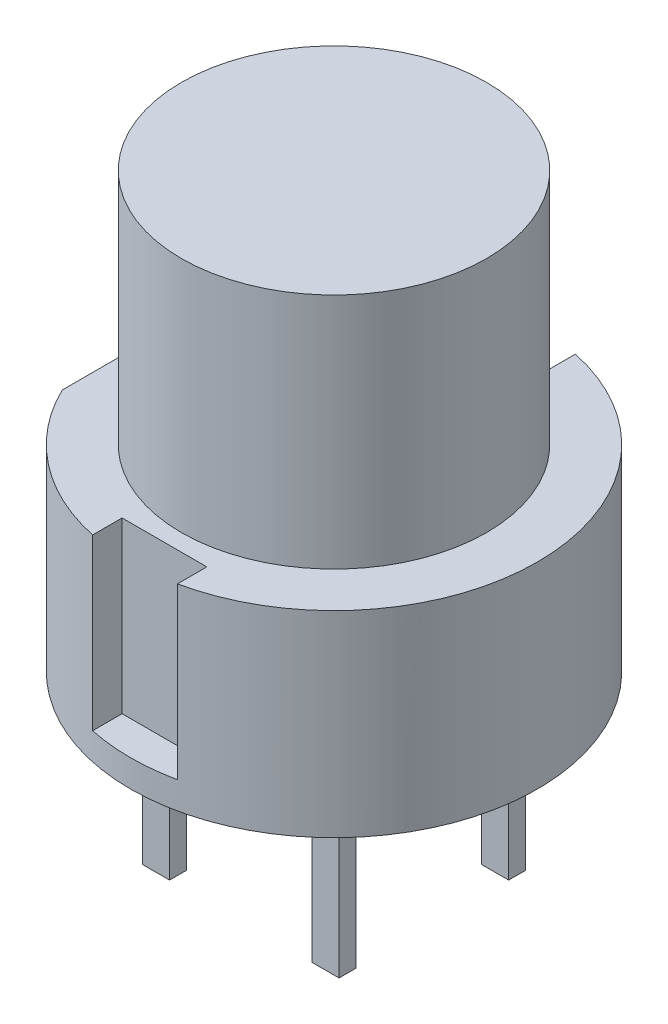
ISO-10303-21;
HEADER;
FILE_DESCRIPTION(('STEP AP214'),'2;1');
FILE_NAME('part.step','',(''),(''),'','','');
FILE_SCHEMA(('AUTOMOTIVE_DESIGN { 1 0 10303 214 1 1 1 1 }'));
ENDSEC;
DATA;
#1=APPLICATION_CONTEXT('core data for automotive mechanical design processes');
#2=APPLICATION_PROTOCOL_DEFINITION('international standard','automotive_design',2000,#1);
#3=PRODUCT_CONTEXT('',#1,'mechanical');
#4=PRODUCT('Part','Part','',(#3));
#5=PRODUCT_RELATED_PRODUCT_CATEGORY('part','',(#4));
#6=PRODUCT_DEFINITION_FORMATION('','',#4);
#7=PRODUCT_DEFINITION_CONTEXT('part definition',#1,'design');
#8=PRODUCT_DEFINITION('design','',#6,#7);
#9=PRODUCT_DEFINITION_SHAPE('','',#8);
#10=(LENGTH_UNIT() NAMED_UNIT(*) SI_UNIT(.MILLI.,.METRE.));
#11=(NAMED_UNIT(*) PLANE_ANGLE_UNIT() SI_UNIT($,.RADIAN.));
#12=(NAMED_UNIT(*) SI_UNIT($,.STERADIAN.) SOLID_ANGLE_UNIT());
#13=UNCERTAINTY_MEASURE_WITH_UNIT(LENGTH_MEASURE(1.E-05),#10,'distance_accuracy_value','');
#14=(GEOMETRIC_REPRESENTATION_CONTEXT(3) GLOBAL_UNCERTAINTY_ASSIGNED_CONTEXT((#13)) GLOBAL_UNIT_ASSIGNED_CONTEXT((#10,
#11,#12)) REPRESENTATION_CONTEXT('',''));
#15=CARTESIAN_POINT('',(0.,0.,0.));
#16=DIRECTION('',(0.,0.,1.));
#17=DIRECTION('',(1.,0.,0.));
#18=AXIS2_PLACEMENT_3D('',#15,#16,#17);
#19=CARTESIAN_POINT('',(2.,1.5,0.));
#20=DIRECTION('',(0.,1.,0.));
#21=DIRECTION('',(0.,0.,1.));
#22=AXIS2_PLACEMENT_3D('',#19,#20,#21);
#23=PLANE('',#22);
#24=DIRECTION('',(-1.,0.,0.));
#25=VECTOR('',#24,1.);
#26=CARTESIAN_POINT('',(2.9,1.5,-2.25000000000001));
#27=LINE('',#26,#25);
#28=CARTESIAN_POINT('',(2.9,1.5,-2.25000000000001));
#29=VERTEX_POINT('',#28);
#30=CARTESIAN_POINT('',(2.1,1.5,-2.25000000000001));
#31=VERTEX_POINT('',#30);
#32=EDGE_CURVE('E299',#29,#31,#27,.T.);
#33=ORIENTED_EDGE('',*,*,#32,.F.);
#34=DIRECTION('',(0.,0.,1.));
#35=VECTOR('',#34,1.);
#36=CARTESIAN_POINT('',(2.9,1.5,-2.25000000000001));
#37=LINE('',#36,#35);
#38=CARTESIAN_POINT('',(2.9,1.5,-2.75000000000001));
#39=VERTEX_POINT('',#38);
#40=EDGE_CURVE('E304',#39,#29,#37,.T.);
#41=ORIENTED_EDGE('',*,*,#40,.F.);
#42=DIRECTION('',(1.,0.,0.));
#43=VECTOR('',#42,1.);
#44=CARTESIAN_POINT('',(2.9,1.5,-2.75000000000001));
#45=LINE('',#44,#43);
#46=CARTESIAN_POINT('',(2.1,1.5,-2.75000000000001));
#47=VERTEX_POINT('',#46);
#48=EDGE_CURVE('E316',#47,#39,#45,.T.);
#49=ORIENTED_EDGE('',*,*,#48,.F.);
#50=DIRECTION('',(0.,0.,-1.));
#51=VECTOR('',#50,1.);
#52=CARTESIAN_POINT('',(2.1,1.5,-2.25000000000001));
#53=LINE('',#52,#51);
#54=EDGE_CURVE('E313',#31,#47,#53,.T.);
#55=ORIENTED_EDGE('',*,*,#54,.F.);
#56=EDGE_LOOP('',(#33,#41,#49,#55));
#57=FACE_BOUND('',#56,.T.);
#58=DIRECTION('',(0.,0.,1.));
#59=VECTOR('',#58,1.);
#60=CARTESIAN_POINT('',(-2.1,1.5,2.25000000000001));
#61=LINE('',#60,#59);
#62=CARTESIAN_POINT('',(-2.1,1.5,2.25000000000001));
#63=VERTEX_POINT('',#62);
#64=CARTESIAN_POINT('',(-2.1,1.5,2.75000000000001));
#65=VERTEX_POINT('',#64);
#66=EDGE_CURVE('E365',#63,#65,#61,.T.);
#67=ORIENTED_EDGE('',*,*,#66,.F.);
#68=DIRECTION('',(1.,0.,0.));
#69=VECTOR('',#68,1.);
#70=CARTESIAN_POINT('',(-2.9,1.5,2.25000000000001));
#71=LINE('',#70,#69);
#72=CARTESIAN_POINT('',(-2.9,1.5,2.25000000000001));
#73=VERTEX_POINT('',#72);
#74=EDGE_CURVE('E370',#73,#63,#71,.T.);
#75=ORIENTED_EDGE('',*,*,#74,.F.);
#76=DIRECTION('',(0.,0.,-1.));
#77=VECTOR('',#76,1.);
#78=CARTESIAN_POINT('',(-2.9,1.5,2.25000000000001));
#79=LINE('',#78,#77);
#80=CARTESIAN_POINT('',(-2.9,1.5,2.75000000000001));
#81=VERTEX_POINT('',#80);
#82=EDGE_CURVE('E382',#81,#73,#79,.T.);
#83=ORIENTED_EDGE('',*,*,#82,.F.);
#84=DIRECTION('',(-1.,0.,0.));
#85=VECTOR('',#84,1.);
#86=CARTESIAN_POINT('',(-2.9,1.5,2.75000000000001));
#87=LINE('',#86,#85);
#88=EDGE_CURVE('E379',#65,#81,#87,.T.);
#89=ORIENTED_EDGE('',*,*,#88,.F.);
#90=EDGE_LOOP('',(#67,#75,#83,#89));
#91=FACE_BOUND('',#90,.T.);
#92=CARTESIAN_POINT('',(0.,1.5,0.));
#93=DIRECTION('',(0.,1.,0.));
#94=DIRECTION('',(0.,0.,1.));
#95=AXIS2_PLACEMENT_3D('',#92,#93,#94);
#96=CIRCLE('',#95,6.);
#97=CARTESIAN_POINT('',(-5.4,1.5,2.61533936612441));
#98=VERTEX_POINT('',#97);
#99=CARTESIAN_POINT('',(-5.4,1.5,-2.61533936612441));
#100=VERTEX_POINT('',#99);
#101=EDGE_CURVE('E408',#98,#100,#96,.T.);
#102=ORIENTED_EDGE('',*,*,#101,.F.);
#103=DIRECTION('',(0.,0.,-1.));
#104=VECTOR('',#103,1.);
#105=CARTESIAN_POINT('',(-5.4,1.5,0.));
#106=LINE('',#105,#104);
#107=EDGE_CURVE('E263',#98,#100,#106,.T.);
#108=ORIENTED_EDGE('',*,*,#107,.T.);
#109=EDGE_LOOP('',(#102,#108));
#110=FACE_BOUND('',#109,.T.);
#111=CARTESIAN_POINT('',(0.,1.5,0.));
#112=DIRECTION('',(0.,1.,0.));
#113=DIRECTION('',(0.,0.,1.));
#114=AXIS2_PLACEMENT_3D('',#111,#112,#113);
#115=CIRCLE('',#114,2.);
#116=CARTESIAN_POINT('',(0.,1.5,2.));
#117=VERTEX_POINT('',#116);
#118=EDGE_CURVE('E412',#117,#117,#115,.T.);
#119=ORIENTED_EDGE('',*,*,#118,.T.);
#120=EDGE_LOOP('',(#119));
#121=FACE_BOUND('',#120,.T.);
#122=DIRECTION('',(0.,0.,1.));
#123=VECTOR('',#122,1.);
#124=CARTESIAN_POINT('',(2.9,1.5,2.25000000000001));
#125=LINE('',#124,#123);
#126=CARTESIAN_POINT('',(2.9,1.5,2.25000000000001));
#127=VERTEX_POINT('',#126);
#128=CARTESIAN_POINT('',(2.9,1.5,2.75000000000001));
#129=VERTEX_POINT('',#128);
#130=EDGE_CURVE('E332',#127,#129,#125,.T.);
#131=ORIENTED_EDGE('',*,*,#130,.F.);
#132=DIRECTION('',(1.,0.,0.));
#133=VECTOR('',#132,1.);
#134=CARTESIAN_POINT('',(2.9,1.5,2.25000000000001));
#135=LINE('',#134,#133);
#136=CARTESIAN_POINT('',(2.1,1.5,2.25000000000001));
#137=VERTEX_POINT('',#136);
#138=EDGE_CURVE('E337',#137,#127,#135,.T.);
#139=ORIENTED_EDGE('',*,*,#138,.F.);
#140=DIRECTION('',(0.,0.,-1.));
#141=VECTOR('',#140,1.);
#142=CARTESIAN_POINT('',(2.1,1.5,2.25000000000001));
#143=LINE('',#142,#141);
#144=CARTESIAN_POINT('',(2.1,1.5,2.75000000000001));
#145=VERTEX_POINT('',#144);
#146=EDGE_CURVE('E349',#145,#137,#143,.T.);
#147=ORIENTED_EDGE('',*,*,#146,.F.);
#148=DIRECTION('',(-1.,0.,0.));
#149=VECTOR('',#148,1.);
#150=CARTESIAN_POINT('',(2.9,1.5,2.75000000000001));
#151=LINE('',#150,#149);
#152=EDGE_CURVE('E346',#129,#145,#151,.T.);
#153=ORIENTED_EDGE('',*,*,#152,.F.);
#154=EDGE_LOOP('',(#131,#139,#147,#153));
#155=FACE_BOUND('',#154,.T.);
#156=DIRECTION('',(-1.,0.,0.));
#157=VECTOR('',#156,1.);
#158=CARTESIAN_POINT('',(-2.9,1.5,-2.25000000000001));
#159=LINE('',#158,#157);
#160=CARTESIAN_POINT('',(-2.1,1.5,-2.25000000000001));
#161=VERTEX_POINT('',#160);
#162=CARTESIAN_POINT('',(-2.9,1.5,-2.25000000000001));
#163=VERTEX_POINT('',#162);
#164=EDGE_CURVE('E266',#161,#163,#159,.T.);
#165=ORIENTED_EDGE('',*,*,#164,.F.);
#166=DIRECTION('',(0.,0.,1.));
#167=VECTOR('',#166,1.);
#168=CARTESIAN_POINT('',(-2.1,1.5,-2.25000000000001));
#169=LINE('',#168,#167);
#170=CARTESIAN_POINT('',(-2.1,1.5,-2.75000000000001));
#171=VERTEX_POINT('',#170);
#172=EDGE_CURVE('E271',#171,#161,#169,.T.);
#173=ORIENTED_EDGE('',*,*,#172,.F.);
#174=DIRECTION('',(1.,0.,0.));
#175=VECTOR('',#174,1.);
#176=CARTESIAN_POINT('',(-2.9,1.5,-2.75000000000001));
#177=LINE('',#176,#175);
#178=CARTESIAN_POINT('',(-2.9,1.5,-2.75000000000001));
#179=VERTEX_POINT('',#178);
#180=EDGE_CURVE('E283',#179,#171,#177,.T.);
#181=ORIENTED_EDGE('',*,*,#180,.F.);
#182=DIRECTION('',(0.,0.,-1.));
#183=VECTOR('',#182,1.);
#184=CARTESIAN_POINT('',(-2.9,1.5,-2.25000000000001));
#185=LINE('',#184,#183);
#186=EDGE_CURVE('E280',#163,#179,#185,.T.);
#187=ORIENTED_EDGE('',*,*,#186,.F.);
#188=EDGE_LOOP('',(#165,#173,#181,#187));
#189=FACE_BOUND('',#188,.T.);
#190=ADVANCED_FACE('F30',(#57,#91,#110,#121,#155,#189),#23,.F.);
#191=CARTESIAN_POINT('',(0.,0.,0.));
#192=DIRECTION('',(0.,1.,0.));
#193=DIRECTION('',(0.,0.,1.));
#194=AXIS2_PLACEMENT_3D('',#191,#192,#193);
#195=PLANE('',#194);
#196=CARTESIAN_POINT('',(0.,0.,0.));
#197=DIRECTION('',(0.,1.,0.));
#198=DIRECTION('',(0.,0.,1.));
#199=AXIS2_PLACEMENT_3D('',#196,#197,#198);
#200=CIRCLE('',#199,2.);
#201=CARTESIAN_POINT('',(0.,0.,2.));
#202=VERTEX_POINT('',#201);
#203=EDGE_CURVE('E415',#202,#202,#200,.T.);
#204=ORIENTED_EDGE('',*,*,#203,.F.);
#205=EDGE_LOOP('',(#204));
#206=FACE_BOUND('',#205,.T.);
#207=ADVANCED_FACE('F32',(#206),#195,.F.);
#208=CARTESIAN_POINT('',(0.,33.18289666439,0.));
#209=DIRECTION('',(0.,1.,0.));
#210=DIRECTION('',(0.,0.,1.));
#211=AXIS2_PLACEMENT_3D('',#208,#209,#210);
#212=CYLINDRICAL_SURFACE('',#211,2.);
#213=ORIENTED_EDGE('',*,*,#118,.F.);
#214=EDGE_LOOP('',(#213));
#215=FACE_BOUND('',#214,.T.);
#216=ORIENTED_EDGE('',*,*,#203,.T.);
#217=EDGE_LOOP('',(#216));
#218=FACE_BOUND('',#217,.T.);
#219=ADVANCED_FACE('F547',(#215,#218),#212,.T.);
#220=CARTESIAN_POINT('',(0.,33.18289666439,0.));
#221=DIRECTION('',(0.,1.,0.));
#222=DIRECTION('',(0.,0.,1.));
#223=AXIS2_PLACEMENT_3D('',#220,#221,#222);
#224=CYLINDRICAL_SURFACE('',#223,6.);
#225=CARTESIAN_POINT('',(0.,7.3,0.));
#226=DIRECTION('',(0.,1.,0.));
#227=DIRECTION('',(0.,0.,1.));
#228=AXIS2_PLACEMENT_3D('',#225,#226,#227);
#229=CIRCLE('',#228,6.);
#230=CARTESIAN_POINT('',(1.25,7.3,5.86834729715275));
#231=VERTEX_POINT('',#230);
#232=CARTESIAN_POINT('',(1.25,7.3,-5.86834729715275));
#233=VERTEX_POINT('',#232);
#234=EDGE_CURVE('E409',#231,#233,#229,.T.);
#235=ORIENTED_EDGE('',*,*,#234,.F.);
#236=DIRECTION('',(0.,1.,0.));
#237=VECTOR('',#236,1.);
#238=CARTESIAN_POINT('',(1.25,33.18289666439,5.86834729715275));
#239=LINE('',#238,#237);
#240=CARTESIAN_POINT('',(1.25,2.3,5.86834729715275));
#241=VERTEX_POINT('',#240);
#242=EDGE_CURVE('E231',#231,#241,#239,.F.);
#243=ORIENTED_EDGE('',*,*,#242,.T.);
#244=CARTESIAN_POINT('',(0.,2.3,0.));
#245=DIRECTION('',(0.,-1.,0.));
#246=DIRECTION('',(0.,0.,-1.));
#247=AXIS2_PLACEMENT_3D('',#244,#245,#246);
#248=CIRCLE('',#247,6.);
#249=CARTESIAN_POINT('',(-1.25,2.3,5.86834729715275));
#250=VERTEX_POINT('',#249);
#251=EDGE_CURVE('E11',#241,#250,#248,.T.);
#252=ORIENTED_EDGE('',*,*,#251,.T.);
#253=DIRECTION('',(0.,1.,0.));
#254=VECTOR('',#253,1.);
#255=CARTESIAN_POINT('',(-1.25,33.18289666439,5.86834729715275));
#256=LINE('',#255,#254);
#257=CARTESIAN_POINT('',(-1.25,7.3,5.86834729715275));
#258=VERTEX_POINT('',#257);
#259=EDGE_CURVE('E217',#250,#258,#256,.T.);
#260=ORIENTED_EDGE('',*,*,#259,.T.);
#261=CARTESIAN_POINT('',(-5.4,7.3,2.61533936612441));
#262=VERTEX_POINT('',#261);
#263=EDGE_CURVE('E405',#262,#258,#229,.T.);
#264=ORIENTED_EDGE('',*,*,#263,.F.);
#265=DIRECTION('',(0.,1.,0.));
#266=VECTOR('',#265,1.);
#267=CARTESIAN_POINT('',(-5.4,33.18289666439,2.61533936612441));
#268=LINE('',#267,#266);
#269=EDGE_CURVE('E257',#262,#98,#268,.F.);
#270=ORIENTED_EDGE('',*,*,#269,.T.);
#271=ORIENTED_EDGE('',*,*,#101,.T.);
#272=DIRECTION('',(0.,1.,0.));
#273=VECTOR('',#272,1.);
#274=CARTESIAN_POINT('',(-5.4,33.18289666439,-2.61533936612441));
#275=LINE('',#274,#273);
#276=CARTESIAN_POINT('',(-5.4,7.3,-2.61533936612441));
#277=VERTEX_POINT('',#276);
#278=EDGE_CURVE('E260',#100,#277,#275,.T.);
#279=ORIENTED_EDGE('',*,*,#278,.T.);
#280=CARTESIAN_POINT('',(-1.25,7.3,-5.86834729715275));
#281=VERTEX_POINT('',#280);
#282=EDGE_CURVE('E404',#281,#277,#229,.T.);
#283=ORIENTED_EDGE('',*,*,#282,.F.);
#284=DIRECTION('',(0.,1.,0.));
#285=VECTOR('',#284,1.);
#286=CARTESIAN_POINT('',(-1.25,33.18289666439,-5.86834729715275));
#287=LINE('',#286,#285);
#288=CARTESIAN_POINT('',(-1.25,2.3,-5.86834729715275));
#289=VERTEX_POINT('',#288);
#290=EDGE_CURVE('E53',#281,#289,#287,.F.);
#291=ORIENTED_EDGE('',*,*,#290,.T.);
#292=CARTESIAN_POINT('',(0.,2.3,0.));
#293=DIRECTION('',(0.,-1.,0.));
#294=DIRECTION('',(0.,0.,-1.));
#295=AXIS2_PLACEMENT_3D('',#292,#293,#294);
#296=CIRCLE('',#295,6.);
#297=CARTESIAN_POINT('',(1.25,2.3,-5.86834729715275));
#298=VERTEX_POINT('',#297);
#299=EDGE_CURVE('E423',#289,#298,#296,.T.);
#300=ORIENTED_EDGE('',*,*,#299,.T.);
#301=DIRECTION('',(0.,1.,0.));
#302=VECTOR('',#301,1.);
#303=CARTESIAN_POINT('',(1.25,33.18289666439,-5.86834729715275));
#304=LINE('',#303,#302);
#305=EDGE_CURVE('E254',#298,#233,#304,.T.);
#306=ORIENTED_EDGE('',*,*,#305,.T.);
#307=EDGE_LOOP('',(#235,#243,#252,#260,#264,#270,#271,#279,#283,#291,#300,#306));
#308=FACE_BOUND('',#307,.T.);
#309=ADVANCED_FACE('F432',(#308),#224,.T.);
#310=CARTESIAN_POINT('',(6.,7.3,0.));
#311=DIRECTION('',(0.,-1.,0.));
#312=DIRECTION('',(0.,0.,-1.));
#313=AXIS2_PLACEMENT_3D('',#310,#311,#312);
#314=PLANE('',#313);
#315=CARTESIAN_POINT('',(0.,7.3,0.));
#316=DIRECTION('',(0.,1.,0.));
#317=DIRECTION('',(0.,0.,1.));
#318=AXIS2_PLACEMENT_3D('',#315,#316,#317);
#319=CIRCLE('',#318,4.5);
#320=CARTESIAN_POINT('',(0.,7.3,4.5));
#321=VERTEX_POINT('',#320);
#322=EDGE_CURVE('E401',#321,#321,#319,.T.);
#323=ORIENTED_EDGE('',*,*,#322,.F.);
#324=EDGE_LOOP('',(#323));
#325=FACE_BOUND('',#324,.T.);
#326=DIRECTION('',(-1.,0.,0.));
#327=VECTOR('',#326,1.);
#328=CARTESIAN_POINT('',(-1.25,7.3,5.));
#329=LINE('',#328,#327);
#330=CARTESIAN_POINT('',(1.25,7.3,5.));
#331=VERTEX_POINT('',#330);
#332=CARTESIAN_POINT('',(-1.25,7.3,5.));
#333=VERTEX_POINT('',#332);
#334=EDGE_CURVE('E45',#331,#333,#329,.T.);
#335=ORIENTED_EDGE('',*,*,#334,.F.);
#336=DIRECTION('',(0.,0.,1.));
#337=VECTOR('',#336,1.);
#338=CARTESIAN_POINT('',(1.25,7.3,0.));
#339=LINE('',#338,#337);
#340=EDGE_CURVE('E38',#331,#231,#339,.T.);
#341=ORIENTED_EDGE('',*,*,#340,.T.);
#342=ORIENTED_EDGE('',*,*,#234,.T.);
#343=DIRECTION('',(0.,0.,-1.));
#344=VECTOR('',#343,1.);
#345=CARTESIAN_POINT('',(1.25,7.3,-5.));
#346=LINE('',#345,#344);
#347=CARTESIAN_POINT('',(1.25,7.3,-5.));
#348=VERTEX_POINT('',#347);
#349=EDGE_CURVE('E234',#348,#233,#346,.T.);
#350=ORIENTED_EDGE('',*,*,#349,.F.);
#351=DIRECTION('',(1.,0.,0.));
#352=VECTOR('',#351,1.);
#353=CARTESIAN_POINT('',(-1.25,7.3,-5.));
#354=LINE('',#353,#352);
#355=CARTESIAN_POINT('',(-1.25,7.3,-5.));
#356=VERTEX_POINT('',#355);
#357=EDGE_CURVE('E239',#356,#348,#354,.T.);
#358=ORIENTED_EDGE('',*,*,#357,.F.);
#359=DIRECTION('',(0.,0.,-1.));
#360=VECTOR('',#359,1.);
#361=CARTESIAN_POINT('',(-1.25,7.3,0.));
#362=LINE('',#361,#360);
#363=EDGE_CURVE('E421',#356,#281,#362,.T.);
#364=ORIENTED_EDGE('',*,*,#363,.T.);
#365=ORIENTED_EDGE('',*,*,#282,.T.);
#366=DIRECTION('',(0.,0.,1.));
#367=VECTOR('',#366,1.);
#368=CARTESIAN_POINT('',(-5.4,7.3,0.));
#369=LINE('',#368,#367);
#370=EDGE_CURVE('E418',#277,#262,#369,.T.);
#371=ORIENTED_EDGE('',*,*,#370,.T.);
#372=ORIENTED_EDGE('',*,*,#263,.T.);
#373=DIRECTION('',(0.,0.,1.));
#374=VECTOR('',#373,1.);
#375=CARTESIAN_POINT('',(-1.25,7.3,5.));
#376=LINE('',#375,#374);
#377=EDGE_CURVE('E223',#333,#258,#376,.T.);
#378=ORIENTED_EDGE('',*,*,#377,.F.);
#379=EDGE_LOOP('',(#335,#341,#342,#350,#358,#364,#365,#371,#372,#378));
#380=FACE_BOUND('',#379,.T.);
#381=ADVANCED_FACE('F428',(#325,#380),#314,.F.);
#382=CARTESIAN_POINT('',(0.,33.18289666439,0.));
#383=DIRECTION('',(0.,1.,0.));
#384=DIRECTION('',(0.,0.,1.));
#385=AXIS2_PLACEMENT_3D('',#382,#383,#384);
#386=CYLINDRICAL_SURFACE('',#385,4.5);
#387=CARTESIAN_POINT('',(0.,14.3,0.));
#388=DIRECTION('',(0.,1.,0.));
#389=DIRECTION('',(0.,0.,1.));
#390=AXIS2_PLACEMENT_3D('',#387,#388,#389);
#391=CIRCLE('',#390,4.5);
#392=CARTESIAN_POINT('',(0.,14.3,4.5));
#393=VERTEX_POINT('',#392);
#394=EDGE_CURVE('E398',#393,#393,#391,.T.);
#395=ORIENTED_EDGE('',*,*,#394,.F.);
#396=EDGE_LOOP('',(#395));
#397=FACE_BOUND('',#396,.T.);
#398=ORIENTED_EDGE('',*,*,#322,.T.);
#399=EDGE_LOOP('',(#398));
#400=FACE_BOUND('',#399,.T.);
#401=ADVANCED_FACE('F538',(#397,#400),#386,.T.);
#402=CARTESIAN_POINT('',(4.5,14.3,0.));
#403=DIRECTION('',(0.,-1.,0.));
#404=DIRECTION('',(0.,0.,-1.));
#405=AXIS2_PLACEMENT_3D('',#402,#403,#404);
#406=PLANE('',#405);
#407=ORIENTED_EDGE('',*,*,#394,.T.);
#408=EDGE_LOOP('',(#407));
#409=FACE_BOUND('',#408,.T.);
#410=ADVANCED_FACE('F534',(#409),#406,.F.);
#411=CARTESIAN_POINT('',(-2.1,-3.5,2.25000000000001));
#412=DIRECTION('',(-1.,0.,0.));
#413=DIRECTION('',(0.,0.,1.));
#414=AXIS2_PLACEMENT_3D('',#411,#412,#413);
#415=PLANE('',#414);
#416=ORIENTED_EDGE('',*,*,#66,.T.);
#417=DIRECTION('',(0.,1.,0.));
#418=VECTOR('',#417,1.);
#419=CARTESIAN_POINT('',(-2.1,-3.5,2.75000000000001));
#420=LINE('',#419,#418);
#421=CARTESIAN_POINT('',(-2.1,-3.5,2.75000000000001));
#422=VERTEX_POINT('',#421);
#423=EDGE_CURVE('E395',#422,#65,#420,.T.);
#424=ORIENTED_EDGE('',*,*,#423,.F.);
#425=DIRECTION('',(0.,0.,1.));
#426=VECTOR('',#425,1.);
#427=CARTESIAN_POINT('',(-2.1,-3.5,2.25000000000001));
#428=LINE('',#427,#426);
#429=CARTESIAN_POINT('',(-2.1,-3.5,2.25000000000001));
#430=VERTEX_POINT('',#429);
#431=EDGE_CURVE('E366',#430,#422,#428,.T.);
#432=ORIENTED_EDGE('',*,*,#431,.F.);
#433=DIRECTION('',(0.,1.,0.));
#434=VECTOR('',#433,1.);
#435=CARTESIAN_POINT('',(-2.1,-3.5,2.25000000000001));
#436=LINE('',#435,#434);
#437=EDGE_CURVE('E376',#430,#63,#436,.T.);
#438=ORIENTED_EDGE('',*,*,#437,.T.);
#439=EDGE_LOOP('',(#416,#424,#432,#438));
#440=FACE_BOUND('',#439,.T.);
#441=ADVANCED_FACE('F530',(#440),#415,.F.);
#442=CARTESIAN_POINT('',(-2.9,-3.5,2.75000000000001));
#443=DIRECTION('',(0.,0.,-1.));
#444=DIRECTION('',(-1.,0.,0.));
#445=AXIS2_PLACEMENT_3D('',#442,#443,#444);
#446=PLANE('',#445);
#447=ORIENTED_EDGE('',*,*,#88,.T.);
#448=DIRECTION('',(0.,1.,0.));
#449=VECTOR('',#448,1.);
#450=CARTESIAN_POINT('',(-2.9,-3.5,2.75000000000001));
#451=LINE('',#450,#449);
#452=CARTESIAN_POINT('',(-2.9,-3.5,2.75000000000001));
#453=VERTEX_POINT('',#452);
#454=EDGE_CURVE('E392',#453,#81,#451,.T.);
#455=ORIENTED_EDGE('',*,*,#454,.F.);
#456=DIRECTION('',(-1.,0.,0.));
#457=VECTOR('',#456,1.);
#458=CARTESIAN_POINT('',(-2.9,-3.5,2.75000000000001));
#459=LINE('',#458,#457);
#460=EDGE_CURVE('E369',#422,#453,#459,.T.);
#461=ORIENTED_EDGE('',*,*,#460,.F.);
#462=ORIENTED_EDGE('',*,*,#423,.T.);
#463=EDGE_LOOP('',(#447,#455,#461,#462));
#464=FACE_BOUND('',#463,.T.);
#465=ADVANCED_FACE('F526',(#464),#446,.F.);
#466=CARTESIAN_POINT('',(-2.9,-3.5,2.25000000000001));
#467=DIRECTION('',(1.,0.,0.));
#468=DIRECTION('',(0.,0.,-1.));
#469=AXIS2_PLACEMENT_3D('',#466,#467,#468);
#470=PLANE('',#469);
#471=ORIENTED_EDGE('',*,*,#82,.T.);
#472=DIRECTION('',(0.,1.,0.));
#473=VECTOR('',#472,1.);
#474=CARTESIAN_POINT('',(-2.9,-3.5,2.25000000000001));
#475=LINE('',#474,#473);
#476=CARTESIAN_POINT('',(-2.9,-3.5,2.25000000000001));
#477=VERTEX_POINT('',#476);
#478=EDGE_CURVE('E389',#477,#73,#475,.T.);
#479=ORIENTED_EDGE('',*,*,#478,.F.);
#480=DIRECTION('',(0.,0.,-1.));
#481=VECTOR('',#480,1.);
#482=CARTESIAN_POINT('',(-2.9,-3.5,2.25000000000001));
#483=LINE('',#482,#481);
#484=EDGE_CURVE('E372',#453,#477,#483,.T.);
#485=ORIENTED_EDGE('',*,*,#484,.F.);
#486=ORIENTED_EDGE('',*,*,#454,.T.);
#487=EDGE_LOOP('',(#471,#479,#485,#486));
#488=FACE_BOUND('',#487,.T.);
#489=ADVANCED_FACE('F522',(#488),#470,.F.);
#490=CARTESIAN_POINT('',(-2.9,-3.5,2.25000000000001));
#491=DIRECTION('',(0.,0.,1.));
#492=DIRECTION('',(1.,0.,0.));
#493=AXIS2_PLACEMENT_3D('',#490,#491,#492);
#494=PLANE('',#493);
#495=ORIENTED_EDGE('',*,*,#74,.T.);
#496=ORIENTED_EDGE('',*,*,#437,.F.);
#497=DIRECTION('',(1.,0.,0.));
#498=VECTOR('',#497,1.);
#499=CARTESIAN_POINT('',(-2.9,-3.5,2.25000000000001));
#500=LINE('',#499,#498);
#501=EDGE_CURVE('E374',#477,#430,#500,.T.);
#502=ORIENTED_EDGE('',*,*,#501,.F.);
#503=ORIENTED_EDGE('',*,*,#478,.T.);
#504=EDGE_LOOP('',(#495,#496,#502,#503));
#505=FACE_BOUND('',#504,.T.);
#506=ADVANCED_FACE('F518',(#505),#494,.F.);
#507=CARTESIAN_POINT('',(-2.1,-3.5,2.75000000000001));
#508=DIRECTION('',(0.,1.,0.));
#509=DIRECTION('',(0.,0.,1.));
#510=AXIS2_PLACEMENT_3D('',#507,#508,#509);
#511=PLANE('',#510);
#512=ORIENTED_EDGE('',*,*,#431,.T.);
#513=ORIENTED_EDGE('',*,*,#460,.T.);
#514=ORIENTED_EDGE('',*,*,#484,.T.);
#515=ORIENTED_EDGE('',*,*,#501,.T.);
#516=EDGE_LOOP('',(#512,#513,#514,#515));
#517=FACE_BOUND('',#516,.T.);
#518=ADVANCED_FACE('F514',(#517),#511,.F.);
#519=CARTESIAN_POINT('',(2.9,-3.5,2.25000000000001));
#520=DIRECTION('',(-1.,0.,0.));
#521=DIRECTION('',(0.,0.,1.));
#522=AXIS2_PLACEMENT_3D('',#519,#520,#521);
#523=PLANE('',#522);
#524=ORIENTED_EDGE('',*,*,#130,.T.);
#525=DIRECTION('',(0.,1.,0.));
#526=VECTOR('',#525,1.);
#527=CARTESIAN_POINT('',(2.9,-3.5,2.75000000000001));
#528=LINE('',#527,#526);
#529=CARTESIAN_POINT('',(2.9,-3.5,2.75000000000001));
#530=VERTEX_POINT('',#529);
#531=EDGE_CURVE('E362',#530,#129,#528,.T.);
#532=ORIENTED_EDGE('',*,*,#531,.F.);
#533=DIRECTION('',(0.,0.,1.));
#534=VECTOR('',#533,1.);
#535=CARTESIAN_POINT('',(2.9,-3.5,2.25000000000001));
#536=LINE('',#535,#534);
#537=CARTESIAN_POINT('',(2.9,-3.5,2.25000000000001));
#538=VERTEX_POINT('',#537);
#539=EDGE_CURVE('E333',#538,#530,#536,.T.);
#540=ORIENTED_EDGE('',*,*,#539,.F.);
#541=DIRECTION('',(0.,1.,0.));
#542=VECTOR('',#541,1.);
#543=CARTESIAN_POINT('',(2.9,-3.5,2.25000000000001));
#544=LINE('',#543,#542);
#545=EDGE_CURVE('E343',#538,#127,#544,.T.);
#546=ORIENTED_EDGE('',*,*,#545,.T.);
#547=EDGE_LOOP('',(#524,#532,#540,#546));
#548=FACE_BOUND('',#547,.T.);
#549=ADVANCED_FACE('F510',(#548),#523,.F.);
#550=CARTESIAN_POINT('',(2.9,-3.5,2.75000000000001));
#551=DIRECTION('',(0.,0.,-1.));
#552=DIRECTION('',(-1.,0.,0.));
#553=AXIS2_PLACEMENT_3D('',#550,#551,#552);
#554=PLANE('',#553);
#555=ORIENTED_EDGE('',*,*,#152,.T.);
#556=DIRECTION('',(0.,1.,0.));
#557=VECTOR('',#556,1.);
#558=CARTESIAN_POINT('',(2.1,-3.5,2.75000000000001));
#559=LINE('',#558,#557);
#560=CARTESIAN_POINT('',(2.1,-3.5,2.75000000000001));
#561=VERTEX_POINT('',#560);
#562=EDGE_CURVE('E359',#561,#145,#559,.T.);
#563=ORIENTED_EDGE('',*,*,#562,.F.);
#564=DIRECTION('',(-1.,0.,0.));
#565=VECTOR('',#564,1.);
#566=CARTESIAN_POINT('',(2.9,-3.5,2.75000000000001));
#567=LINE('',#566,#565);
#568=EDGE_CURVE('E336',#530,#561,#567,.T.);
#569=ORIENTED_EDGE('',*,*,#568,.F.);
#570=ORIENTED_EDGE('',*,*,#531,.T.);
#571=EDGE_LOOP('',(#555,#563,#569,#570));
#572=FACE_BOUND('',#571,.T.);
#573=ADVANCED_FACE('F506',(#572),#554,.F.);
#574=CARTESIAN_POINT('',(2.1,-3.5,2.25000000000001));
#575=DIRECTION('',(1.,0.,0.));
#576=DIRECTION('',(0.,0.,-1.));
#577=AXIS2_PLACEMENT_3D('',#574,#575,#576);
#578=PLANE('',#577);
#579=ORIENTED_EDGE('',*,*,#146,.T.);
#580=DIRECTION('',(0.,1.,0.));
#581=VECTOR('',#580,1.);
#582=CARTESIAN_POINT('',(2.1,-3.5,2.25000000000001));
#583=LINE('',#582,#581);
#584=CARTESIAN_POINT('',(2.1,-3.5,2.25000000000001));
#585=VERTEX_POINT('',#584);
#586=EDGE_CURVE('E356',#585,#137,#583,.T.);
#587=ORIENTED_EDGE('',*,*,#586,.F.);
#588=DIRECTION('',(0.,0.,-1.));
#589=VECTOR('',#588,1.);
#590=CARTESIAN_POINT('',(2.1,-3.5,2.25000000000001));
#591=LINE('',#590,#589);
#592=EDGE_CURVE('E339',#561,#585,#591,.T.);
#593=ORIENTED_EDGE('',*,*,#592,.F.);
#594=ORIENTED_EDGE('',*,*,#562,.T.);
#595=EDGE_LOOP('',(#579,#587,#593,#594));
#596=FACE_BOUND('',#595,.T.);
#597=ADVANCED_FACE('F502',(#596),#578,.F.);
#598=CARTESIAN_POINT('',(2.9,-3.5,2.25000000000001));
#599=DIRECTION('',(0.,0.,1.));
#600=DIRECTION('',(1.,0.,0.));
#601=AXIS2_PLACEMENT_3D('',#598,#599,#600);
#602=PLANE('',#601);
#603=ORIENTED_EDGE('',*,*,#138,.T.);
#604=ORIENTED_EDGE('',*,*,#545,.F.);
#605=DIRECTION('',(1.,0.,0.));
#606=VECTOR('',#605,1.);
#607=CARTESIAN_POINT('',(2.9,-3.5,2.25000000000001));
#608=LINE('',#607,#606);
#609=EDGE_CURVE('E341',#585,#538,#608,.T.);
#610=ORIENTED_EDGE('',*,*,#609,.F.);
#611=ORIENTED_EDGE('',*,*,#586,.T.);
#612=EDGE_LOOP('',(#603,#604,#610,#611));
#613=FACE_BOUND('',#612,.T.);
#614=ADVANCED_FACE('F498',(#613),#602,.F.);
#615=CARTESIAN_POINT('',(2.9,-3.5,2.75000000000001));
#616=DIRECTION('',(0.,-1.,0.));
#617=DIRECTION('',(0.,0.,-1.));
#618=AXIS2_PLACEMENT_3D('',#615,#616,#617);
#619=PLANE('',#618);
#620=ORIENTED_EDGE('',*,*,#539,.T.);
#621=ORIENTED_EDGE('',*,*,#568,.T.);
#622=ORIENTED_EDGE('',*,*,#592,.T.);
#623=ORIENTED_EDGE('',*,*,#609,.T.);
#624=EDGE_LOOP('',(#620,#621,#622,#623));
#625=FACE_BOUND('',#624,.T.);
#626=ADVANCED_FACE('F494',(#625),#619,.T.);
#627=CARTESIAN_POINT('',(2.9,-3.5,-2.25000000000001));
#628=DIRECTION('',(0.,0.,-1.));
#629=DIRECTION('',(-1.,0.,0.));
#630=AXIS2_PLACEMENT_3D('',#627,#628,#629);
#631=PLANE('',#630);
#632=ORIENTED_EDGE('',*,*,#32,.T.);
#633=DIRECTION('',(0.,1.,0.));
#634=VECTOR('',#633,1.);
#635=CARTESIAN_POINT('',(2.1,-3.5,-2.25000000000001));
#636=LINE('',#635,#634);
#637=CARTESIAN_POINT('',(2.1,-3.5,-2.25000000000001));
#638=VERTEX_POINT('',#637);
#639=EDGE_CURVE('E329',#638,#31,#636,.T.);
#640=ORIENTED_EDGE('',*,*,#639,.F.);
#641=DIRECTION('',(-1.,0.,0.));
#642=VECTOR('',#641,1.);
#643=CARTESIAN_POINT('',(2.9,-3.5,-2.25000000000001));
#644=LINE('',#643,#642);
#645=CARTESIAN_POINT('',(2.9,-3.5,-2.25000000000001));
#646=VERTEX_POINT('',#645);
#647=EDGE_CURVE('E300',#646,#638,#644,.T.);
#648=ORIENTED_EDGE('',*,*,#647,.F.);
#649=DIRECTION('',(0.,1.,0.));
#650=VECTOR('',#649,1.);
#651=CARTESIAN_POINT('',(2.9,-3.5,-2.25000000000001));
#652=LINE('',#651,#650);
#653=EDGE_CURVE('E310',#646,#29,#652,.T.);
#654=ORIENTED_EDGE('',*,*,#653,.T.);
#655=EDGE_LOOP('',(#632,#640,#648,#654));
#656=FACE_BOUND('',#655,.T.);
#657=ADVANCED_FACE('F490',(#656),#631,.F.);
#658=CARTESIAN_POINT('',(2.1,-3.5,-2.25000000000001));
#659=DIRECTION('',(1.,0.,0.));
#660=DIRECTION('',(0.,0.,-1.));
#661=AXIS2_PLACEMENT_3D('',#658,#659,#660);
#662=PLANE('',#661);
#663=ORIENTED_EDGE('',*,*,#54,.T.);
#664=DIRECTION('',(0.,1.,0.));
#665=VECTOR('',#664,1.);
#666=CARTESIAN_POINT('',(2.1,-3.5,-2.75000000000001));
#667=LINE('',#666,#665);
#668=CARTESIAN_POINT('',(2.1,-3.5,-2.75000000000001));
#669=VERTEX_POINT('',#668);
#670=EDGE_CURVE('E326',#669,#47,#667,.T.);
#671=ORIENTED_EDGE('',*,*,#670,.F.);
#672=DIRECTION('',(0.,0.,-1.));
#673=VECTOR('',#672,1.);
#674=CARTESIAN_POINT('',(2.1,-3.5,-2.25000000000001));
#675=LINE('',#674,#673);
#676=EDGE_CURVE('E303',#638,#669,#675,.T.);
#677=ORIENTED_EDGE('',*,*,#676,.F.);
#678=ORIENTED_EDGE('',*,*,#639,.T.);
#679=EDGE_LOOP('',(#663,#671,#677,#678));
#680=FACE_BOUND('',#679,.T.);
#681=ADVANCED_FACE('F486',(#680),#662,.F.);
#682=CARTESIAN_POINT('',(2.9,-3.5,-2.75000000000001));
#683=DIRECTION('',(0.,0.,1.));
#684=DIRECTION('',(1.,0.,0.));
#685=AXIS2_PLACEMENT_3D('',#682,#683,#684);
#686=PLANE('',#685);
#687=ORIENTED_EDGE('',*,*,#48,.T.);
#688=DIRECTION('',(0.,1.,0.));
#689=VECTOR('',#688,1.);
#690=CARTESIAN_POINT('',(2.9,-3.5,-2.75000000000001));
#691=LINE('',#690,#689);
#692=CARTESIAN_POINT('',(2.9,-3.5,-2.75000000000001));
#693=VERTEX_POINT('',#692);
#694=EDGE_CURVE('E323',#693,#39,#691,.T.);
#695=ORIENTED_EDGE('',*,*,#694,.F.);
#696=DIRECTION('',(1.,0.,0.));
#697=VECTOR('',#696,1.);
#698=CARTESIAN_POINT('',(2.9,-3.5,-2.75000000000001));
#699=LINE('',#698,#697);
#700=EDGE_CURVE('E306',#669,#693,#699,.T.);
#701=ORIENTED_EDGE('',*,*,#700,.F.);
#702=ORIENTED_EDGE('',*,*,#670,.T.);
#703=EDGE_LOOP('',(#687,#695,#701,#702));
#704=FACE_BOUND('',#703,.T.);
#705=ADVANCED_FACE('F482',(#704),#686,.F.);
#706=CARTESIAN_POINT('',(2.9,-3.5,-2.25000000000001));
#707=DIRECTION('',(-1.,0.,0.));
#708=DIRECTION('',(0.,0.,1.));
#709=AXIS2_PLACEMENT_3D('',#706,#707,#708);
#710=PLANE('',#709);
#711=ORIENTED_EDGE('',*,*,#40,.T.);
#712=ORIENTED_EDGE('',*,*,#653,.F.);
#713=DIRECTION('',(0.,0.,1.));
#714=VECTOR('',#713,1.);
#715=CARTESIAN_POINT('',(2.9,-3.5,-2.25000000000001));
#716=LINE('',#715,#714);
#717=EDGE_CURVE('E308',#693,#646,#716,.T.);
#718=ORIENTED_EDGE('',*,*,#717,.F.);
#719=ORIENTED_EDGE('',*,*,#694,.T.);
#720=EDGE_LOOP('',(#711,#712,#718,#719));
#721=FACE_BOUND('',#720,.T.);
#722=ADVANCED_FACE('F478',(#721),#710,.F.);
#723=CARTESIAN_POINT('',(2.1,-3.5,-2.25000000000001));
#724=DIRECTION('',(0.,-1.,0.));
#725=DIRECTION('',(0.,0.,-1.));
#726=AXIS2_PLACEMENT_3D('',#723,#724,#725);
#727=PLANE('',#726);
#728=ORIENTED_EDGE('',*,*,#647,.T.);
#729=ORIENTED_EDGE('',*,*,#676,.T.);
#730=ORIENTED_EDGE('',*,*,#700,.T.);
#731=ORIENTED_EDGE('',*,*,#717,.T.);
#732=EDGE_LOOP('',(#728,#729,#730,#731));
#733=FACE_BOUND('',#732,.T.);
#734=ADVANCED_FACE('F472',(#733),#727,.T.);
#735=CARTESIAN_POINT('',(-2.9,-3.5,-2.25000000000001));
#736=DIRECTION('',(0.,0.,-1.));
#737=DIRECTION('',(-1.,0.,0.));
#738=AXIS2_PLACEMENT_3D('',#735,#736,#737);
#739=PLANE('',#738);
#740=ORIENTED_EDGE('',*,*,#164,.T.);
#741=DIRECTION('',(0.,1.,0.));
#742=VECTOR('',#741,1.);
#743=CARTESIAN_POINT('',(-2.9,-3.5,-2.25000000000001));
#744=LINE('',#743,#742);
#745=CARTESIAN_POINT('',(-2.9,-3.5,-2.25000000000001));
#746=VERTEX_POINT('',#745);
#747=EDGE_CURVE('E296',#746,#163,#744,.T.);
#748=ORIENTED_EDGE('',*,*,#747,.F.);
#749=DIRECTION('',(-1.,0.,0.));
#750=VECTOR('',#749,1.);
#751=CARTESIAN_POINT('',(-2.9,-3.5,-2.25000000000001));
#752=LINE('',#751,#750);
#753=CARTESIAN_POINT('',(-2.1,-3.5,-2.25000000000001));
#754=VERTEX_POINT('',#753);
#755=EDGE_CURVE('E267',#754,#746,#752,.T.);
#756=ORIENTED_EDGE('',*,*,#755,.F.);
#757=DIRECTION('',(0.,1.,0.));
#758=VECTOR('',#757,1.);
#759=CARTESIAN_POINT('',(-2.1,-3.5,-2.25000000000001));
#760=LINE('',#759,#758);
#761=EDGE_CURVE('E277',#754,#161,#760,.T.);
#762=ORIENTED_EDGE('',*,*,#761,.T.);
#763=EDGE_LOOP('',(#740,#748,#756,#762));
#764=FACE_BOUND('',#763,.T.);
#765=ADVANCED_FACE('F456',(#764),#739,.F.);
#766=CARTESIAN_POINT('',(-2.9,-3.5,-2.25000000000001));
#767=DIRECTION('',(1.,0.,0.));
#768=DIRECTION('',(0.,0.,-1.));
#769=AXIS2_PLACEMENT_3D('',#766,#767,#768);
#770=PLANE('',#769);
#771=ORIENTED_EDGE('',*,*,#186,.T.);
#772=DIRECTION('',(0.,1.,0.));
#773=VECTOR('',#772,1.);
#774=CARTESIAN_POINT('',(-2.9,-3.5,-2.75000000000001));
#775=LINE('',#774,#773);
#776=CARTESIAN_POINT('',(-2.9,-3.5,-2.75000000000001));
#777=VERTEX_POINT('',#776);
#778=EDGE_CURVE('E293',#777,#179,#775,.T.);
#779=ORIENTED_EDGE('',*,*,#778,.F.);
#780=DIRECTION('',(0.,0.,-1.));
#781=VECTOR('',#780,1.);
#782=CARTESIAN_POINT('',(-2.9,-3.5,-2.25000000000001));
#783=LINE('',#782,#781);
#784=EDGE_CURVE('E270',#746,#777,#783,.T.);
#785=ORIENTED_EDGE('',*,*,#784,.F.);
#786=ORIENTED_EDGE('',*,*,#747,.T.);
#787=EDGE_LOOP('',(#771,#779,#785,#786));
#788=FACE_BOUND('',#787,.T.);
#789=ADVANCED_FACE('F464',(#788),#770,.F.);
#790=CARTESIAN_POINT('',(-2.9,-3.5,-2.75000000000001));
#791=DIRECTION('',(0.,0.,1.));
#792=DIRECTION('',(1.,0.,0.));
#793=AXIS2_PLACEMENT_3D('',#790,#791,#792);
#794=PLANE('',#793);
#795=ORIENTED_EDGE('',*,*,#180,.T.);
#796=DIRECTION('',(0.,1.,0.));
#797=VECTOR('',#796,1.);
#798=CARTESIAN_POINT('',(-2.1,-3.5,-2.75000000000001));
#799=LINE('',#798,#797);
#800=CARTESIAN_POINT('',(-2.1,-3.5,-2.75000000000001));
#801=VERTEX_POINT('',#800);
#802=EDGE_CURVE('E290',#801,#171,#799,.T.);
#803=ORIENTED_EDGE('',*,*,#802,.F.);
#804=DIRECTION('',(1.,0.,0.));
#805=VECTOR('',#804,1.);
#806=CARTESIAN_POINT('',(-2.9,-3.5,-2.75000000000001));
#807=LINE('',#806,#805);
#808=EDGE_CURVE('E273',#777,#801,#807,.T.);
#809=ORIENTED_EDGE('',*,*,#808,.F.);
#810=ORIENTED_EDGE('',*,*,#778,.T.);
#811=EDGE_LOOP('',(#795,#803,#809,#810));
#812=FACE_BOUND('',#811,.T.);
#813=ADVANCED_FACE('F462',(#812),#794,.F.);
#814=CARTESIAN_POINT('',(-2.1,-3.5,-2.25000000000001));
#815=DIRECTION('',(-1.,0.,0.));
#816=DIRECTION('',(0.,0.,1.));
#817=AXIS2_PLACEMENT_3D('',#814,#815,#816);
#818=PLANE('',#817);
#819=ORIENTED_EDGE('',*,*,#172,.T.);
#820=ORIENTED_EDGE('',*,*,#761,.F.);
#821=DIRECTION('',(0.,0.,1.));
#822=VECTOR('',#821,1.);
#823=CARTESIAN_POINT('',(-2.1,-3.5,-2.25000000000001));
#824=LINE('',#823,#822);
#825=EDGE_CURVE('E275',#801,#754,#824,.T.);
#826=ORIENTED_EDGE('',*,*,#825,.F.);
#827=ORIENTED_EDGE('',*,*,#802,.T.);
#828=EDGE_LOOP('',(#819,#820,#826,#827));
#829=FACE_BOUND('',#828,.T.);
#830=ADVANCED_FACE('F452',(#829),#818,.F.);
#831=CARTESIAN_POINT('',(-2.1,-3.5,-2.25000000000001));
#832=DIRECTION('',(0.,1.,0.));
#833=DIRECTION('',(0.,0.,1.));
#834=AXIS2_PLACEMENT_3D('',#831,#832,#833);
#835=PLANE('',#834);
#836=ORIENTED_EDGE('',*,*,#755,.T.);
#837=ORIENTED_EDGE('',*,*,#784,.T.);
#838=ORIENTED_EDGE('',*,*,#808,.T.);
#839=ORIENTED_EDGE('',*,*,#825,.T.);
#840=EDGE_LOOP('',(#836,#837,#838,#839));
#841=FACE_BOUND('',#840,.T.);
#842=ADVANCED_FACE('F458',(#841),#835,.F.);
#843=CARTESIAN_POINT('',(-5.4,-3.5,-6.43380928442046));
#844=DIRECTION('',(1.,0.,0.));
#845=DIRECTION('',(0.,0.,-1.));
#846=AXIS2_PLACEMENT_3D('',#843,#844,#845);
#847=PLANE('',#846);
#848=ORIENTED_EDGE('',*,*,#269,.F.);
#849=ORIENTED_EDGE('',*,*,#370,.F.);
#850=ORIENTED_EDGE('',*,*,#278,.F.);
#851=ORIENTED_EDGE('',*,*,#107,.F.);
#852=EDGE_LOOP('',(#848,#849,#850,#851));
#853=FACE_BOUND('',#852,.T.);
#854=ADVANCED_FACE('F438',(#853),#847,.F.);
#855=CARTESIAN_POINT('',(1.25,2.3,-7.));
#856=DIRECTION('',(0.,-1.,0.));
#857=DIRECTION('',(0.,0.,-1.));
#858=AXIS2_PLACEMENT_3D('',#855,#856,#857);
#859=PLANE('',#858);
#860=DIRECTION('',(0.,0.,1.));
#861=VECTOR('',#860,1.);
#862=CARTESIAN_POINT('',(-1.25,2.3,-5.));
#863=LINE('',#862,#861);
#864=CARTESIAN_POINT('',(-1.25,2.3,-5.));
#865=VERTEX_POINT('',#864);
#866=EDGE_CURVE('E238',#289,#865,#863,.T.);
#867=ORIENTED_EDGE('',*,*,#866,.T.);
#868=DIRECTION('',(1.,0.,0.));
#869=VECTOR('',#868,1.);
#870=CARTESIAN_POINT('',(-1.25,2.3,-5.));
#871=LINE('',#870,#869);
#872=CARTESIAN_POINT('',(1.25,2.3,-5.));
#873=VERTEX_POINT('',#872);
#874=EDGE_CURVE('E241',#865,#873,#871,.T.);
#875=ORIENTED_EDGE('',*,*,#874,.T.);
#876=DIRECTION('',(0.,0.,-1.));
#877=VECTOR('',#876,1.);
#878=CARTESIAN_POINT('',(1.25,2.3,-5.));
#879=LINE('',#878,#877);
#880=EDGE_CURVE('E235',#873,#298,#879,.T.);
#881=ORIENTED_EDGE('',*,*,#880,.T.);
#882=ORIENTED_EDGE('',*,*,#299,.F.);
#883=EDGE_LOOP('',(#867,#875,#881,#882));
#884=FACE_BOUND('',#883,.T.);
#885=ADVANCED_FACE('F578',(#884),#859,.F.);
#886=CARTESIAN_POINT('',(1.25,2.3,-5.));
#887=DIRECTION('',(1.,0.,0.));
#888=DIRECTION('',(0.,0.,-1.));
#889=AXIS2_PLACEMENT_3D('',#886,#887,#888);
#890=PLANE('',#889);
#891=ORIENTED_EDGE('',*,*,#880,.F.);
#892=DIRECTION('',(0.,1.,0.));
#893=VECTOR('',#892,1.);
#894=CARTESIAN_POINT('',(1.25,2.3,-5.));
#895=LINE('',#894,#893);
#896=EDGE_CURVE('E249',#873,#348,#895,.T.);
#897=ORIENTED_EDGE('',*,*,#896,.T.);
#898=ORIENTED_EDGE('',*,*,#349,.T.);
#899=ORIENTED_EDGE('',*,*,#305,.F.);
#900=EDGE_LOOP('',(#891,#897,#898,#899));
#901=FACE_BOUND('',#900,.T.);
#902=ADVANCED_FACE('F595',(#901),#890,.F.);
#903=CARTESIAN_POINT('',(-1.25,2.3,-5.));
#904=DIRECTION('',(-1.,0.,0.));
#905=DIRECTION('',(0.,0.,1.));
#906=AXIS2_PLACEMENT_3D('',#903,#904,#905);
#907=PLANE('',#906);
#908=ORIENTED_EDGE('',*,*,#363,.F.);
#909=DIRECTION('',(0.,1.,0.));
#910=VECTOR('',#909,1.);
#911=CARTESIAN_POINT('',(-1.25,2.3,-5.));
#912=LINE('',#911,#910);
#913=EDGE_CURVE('E244',#865,#356,#912,.T.);
#914=ORIENTED_EDGE('',*,*,#913,.F.);
#915=ORIENTED_EDGE('',*,*,#866,.F.);
#916=ORIENTED_EDGE('',*,*,#290,.F.);
#917=EDGE_LOOP('',(#908,#914,#915,#916));
#918=FACE_BOUND('',#917,.T.);
#919=ADVANCED_FACE('F605',(#918),#907,.F.);
#920=CARTESIAN_POINT('',(-1.25,2.3,-5.));
#921=DIRECTION('',(0.,0.,1.));
#922=DIRECTION('',(1.,0.,0.));
#923=AXIS2_PLACEMENT_3D('',#920,#921,#922);
#924=PLANE('',#923);
#925=ORIENTED_EDGE('',*,*,#357,.T.);
#926=ORIENTED_EDGE('',*,*,#896,.F.);
#927=ORIENTED_EDGE('',*,*,#874,.F.);
#928=ORIENTED_EDGE('',*,*,#913,.T.);
#929=EDGE_LOOP('',(#925,#926,#927,#928));
#930=FACE_BOUND('',#929,.T.);
#931=ADVANCED_FACE('F615',(#930),#924,.F.);
#932=CARTESIAN_POINT('',(1.25,2.3,5.));
#933=DIRECTION('',(0.,-1.,0.));
#934=DIRECTION('',(0.,0.,-1.));
#935=AXIS2_PLACEMENT_3D('',#932,#933,#934);
#936=PLANE('',#935);
#937=DIRECTION('',(0.,0.,-1.));
#938=VECTOR('',#937,1.);
#939=CARTESIAN_POINT('',(1.25,2.3,5.));
#940=LINE('',#939,#938);
#941=CARTESIAN_POINT('',(1.25,2.3,5.));
#942=VERTEX_POINT('',#941);
#943=EDGE_CURVE('E211',#241,#942,#940,.T.);
#944=ORIENTED_EDGE('',*,*,#943,.T.);
#945=DIRECTION('',(-1.,0.,0.));
#946=VECTOR('',#945,1.);
#947=CARTESIAN_POINT('',(-1.25,2.3,5.));
#948=LINE('',#947,#946);
#949=CARTESIAN_POINT('',(-1.25,2.3,5.));
#950=VERTEX_POINT('',#949);
#951=EDGE_CURVE('E207',#942,#950,#948,.T.);
#952=ORIENTED_EDGE('',*,*,#951,.T.);
#953=DIRECTION('',(0.,0.,1.));
#954=VECTOR('',#953,1.);
#955=CARTESIAN_POINT('',(-1.25,2.3,5.));
#956=LINE('',#955,#954);
#957=EDGE_CURVE('E214',#950,#250,#956,.T.);
#958=ORIENTED_EDGE('',*,*,#957,.T.);
#959=ORIENTED_EDGE('',*,*,#251,.F.);
#960=EDGE_LOOP('',(#944,#952,#958,#959));
#961=FACE_BOUND('',#960,.T.);
#962=ADVANCED_FACE('F220',(#961),#936,.F.);
#963=CARTESIAN_POINT('',(1.25,2.3,5.));
#964=DIRECTION('',(1.,0.,0.));
#965=DIRECTION('',(0.,0.,-1.));
#966=AXIS2_PLACEMENT_3D('',#963,#964,#965);
#967=PLANE('',#966);
#968=ORIENTED_EDGE('',*,*,#340,.F.);
#969=DIRECTION('',(0.,1.,0.));
#970=VECTOR('',#969,1.);
#971=CARTESIAN_POINT('',(1.25,2.3,5.));
#972=LINE('',#971,#970);
#973=EDGE_CURVE('E210',#942,#331,#972,.T.);
#974=ORIENTED_EDGE('',*,*,#973,.F.);
#975=ORIENTED_EDGE('',*,*,#943,.F.);
#976=ORIENTED_EDGE('',*,*,#242,.F.);
#977=EDGE_LOOP('',(#968,#974,#975,#976));
#978=FACE_BOUND('',#977,.T.);
#979=ADVANCED_FACE('F633',(#978),#967,.F.);
#980=CARTESIAN_POINT('',(-1.25,2.3,5.));
#981=DIRECTION('',(-1.,0.,0.));
#982=DIRECTION('',(0.,0.,1.));
#983=AXIS2_PLACEMENT_3D('',#980,#981,#982);
#984=PLANE('',#983);
#985=ORIENTED_EDGE('',*,*,#957,.F.);
#986=DIRECTION('',(0.,1.,0.));
#987=VECTOR('',#986,1.);
#988=CARTESIAN_POINT('',(-1.25,2.3,5.));
#989=LINE('',#988,#987);
#990=EDGE_CURVE('E203',#950,#333,#989,.T.);
#991=ORIENTED_EDGE('',*,*,#990,.T.);
#992=ORIENTED_EDGE('',*,*,#377,.T.);
#993=ORIENTED_EDGE('',*,*,#259,.F.);
#994=EDGE_LOOP('',(#985,#991,#992,#993));
#995=FACE_BOUND('',#994,.T.);
#996=ADVANCED_FACE('F215',(#995),#984,.F.);
#997=CARTESIAN_POINT('',(-1.25,2.3,5.));
#998=DIRECTION('',(0.,0.,-1.));
#999=DIRECTION('',(-1.,0.,0.));
#1000=AXIS2_PLACEMENT_3D('',#997,#998,#999);
#1001=PLANE('',#1000);
#1002=ORIENTED_EDGE('',*,*,#334,.T.);
#1003=ORIENTED_EDGE('',*,*,#990,.F.);
#1004=ORIENTED_EDGE('',*,*,#951,.F.);
#1005=ORIENTED_EDGE('',*,*,#973,.T.);
#1006=EDGE_LOOP('',(#1002,#1003,#1004,#1005));
#1007=FACE_BOUND('',#1006,.T.);
#1008=ADVANCED_FACE('F205',(#1007),#1001,.F.);
#1009=CLOSED_SHELL('',(#190,#207,#219,#309,#381,#401,#410,#441,#465,#489,#506,#518,#549,#573,
#597,#614,#626,#657,#681,#705,#722,#734,#765,#789,#813,#830,#842,#854,#885,#902,#919,#931,#962,
#979,#996,#1008));
#1010=MANIFOLD_SOLID_BREP('B2',#1009);
#1011=ADVANCED_BREP_SHAPE_REPRESENTATION('',(#18,#1010),#14);
#1012=SHAPE_DEFINITION_REPRESENTATION(#9,#1011);
ENDSEC;
END-ISO-10303-21;
